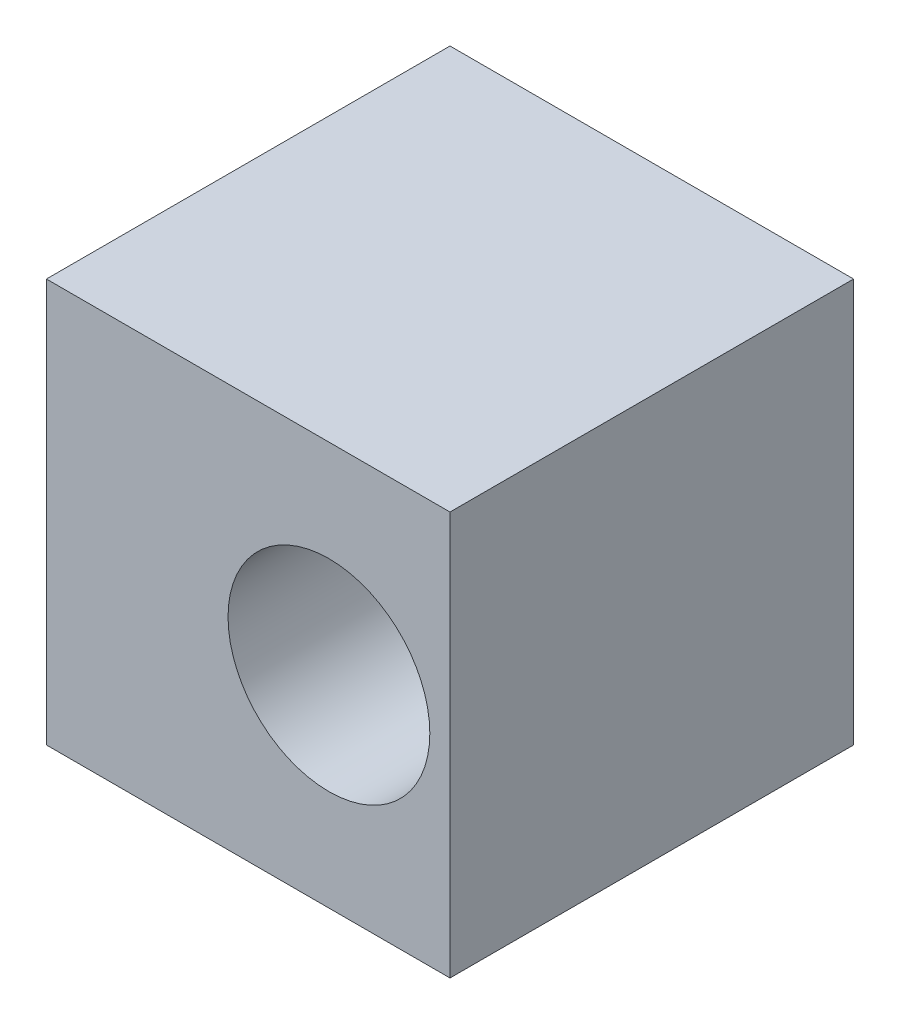
ISO-10303-21;
HEADER;
FILE_DESCRIPTION(('STEP AP214'),'2;1');
FILE_NAME('part.step','',(''),(''),'','','');
FILE_SCHEMA(('AUTOMOTIVE_DESIGN { 1 0 10303 214 1 1 1 1 }'));
ENDSEC;
DATA;
#1=APPLICATION_CONTEXT('core data for automotive mechanical design processes');
#2=APPLICATION_PROTOCOL_DEFINITION('international standard','automotive_design',2000,#1);
#3=PRODUCT_CONTEXT('',#1,'mechanical');
#4=PRODUCT('Part','Part','',(#3));
#5=PRODUCT_RELATED_PRODUCT_CATEGORY('part','',(#4));
#6=PRODUCT_DEFINITION_FORMATION('','',#4);
#7=PRODUCT_DEFINITION_CONTEXT('part definition',#1,'design');
#8=PRODUCT_DEFINITION('design','',#6,#7);
#9=PRODUCT_DEFINITION_SHAPE('','',#8);
#10=(LENGTH_UNIT() NAMED_UNIT(*) SI_UNIT(.MILLI.,.METRE.));
#11=(NAMED_UNIT(*) PLANE_ANGLE_UNIT() SI_UNIT($,.RADIAN.));
#12=(NAMED_UNIT(*) SI_UNIT($,.STERADIAN.) SOLID_ANGLE_UNIT());
#13=UNCERTAINTY_MEASURE_WITH_UNIT(LENGTH_MEASURE(1.E-05),#10,'distance_accuracy_value','');
#14=(GEOMETRIC_REPRESENTATION_CONTEXT(3) GLOBAL_UNCERTAINTY_ASSIGNED_CONTEXT((#13)) GLOBAL_UNIT_ASSIGNED_CONTEXT((#10,
#11,#12)) REPRESENTATION_CONTEXT('',''));
#15=CARTESIAN_POINT('',(0.,0.,0.));
#16=DIRECTION('',(0.,0.,1.));
#17=DIRECTION('',(1.,0.,0.));
#18=AXIS2_PLACEMENT_3D('',#15,#16,#17);
#19=CARTESIAN_POINT('',(0.,0.,10.));
#20=DIRECTION('',(1.,0.,0.));
#21=DIRECTION('',(0.,0.,-1.));
#22=AXIS2_PLACEMENT_3D('',#19,#20,#21);
#23=PLANE('',#22);
#24=DIRECTION('',(0.,-1.,0.));
#25=VECTOR('',#24,1.);
#26=CARTESIAN_POINT('',(0.,0.,0.));
#27=LINE('',#26,#25);
#28=CARTESIAN_POINT('',(0.,10.,0.));
#29=VERTEX_POINT('',#28);
#30=CARTESIAN_POINT('',(0.,0.,0.));
#31=VERTEX_POINT('',#30);
#32=EDGE_CURVE('E98',#29,#31,#27,.T.);
#33=ORIENTED_EDGE('',*,*,#32,.T.);
#34=DIRECTION('',(0.,0.,-1.));
#35=VECTOR('',#34,1.);
#36=CARTESIAN_POINT('',(0.,0.,10.));
#37=LINE('',#36,#35);
#38=CARTESIAN_POINT('',(0.,0.,10.));
#39=VERTEX_POINT('',#38);
#40=EDGE_CURVE('E11',#39,#31,#37,.T.);
#41=ORIENTED_EDGE('',*,*,#40,.F.);
#42=DIRECTION('',(0.,-1.,0.));
#43=VECTOR('',#42,1.);
#44=CARTESIAN_POINT('',(0.,0.,10.));
#45=LINE('',#44,#43);
#46=CARTESIAN_POINT('',(0.,10.,10.));
#47=VERTEX_POINT('',#46);
#48=EDGE_CURVE('E86',#47,#39,#45,.T.);
#49=ORIENTED_EDGE('',*,*,#48,.F.);
#50=DIRECTION('',(0.,0.,-1.));
#51=VECTOR('',#50,1.);
#52=CARTESIAN_POINT('',(0.,10.,10.));
#53=LINE('',#52,#51);
#54=EDGE_CURVE('E94',#47,#29,#53,.T.);
#55=ORIENTED_EDGE('',*,*,#54,.T.);
#56=EDGE_LOOP('',(#33,#41,#49,#55));
#57=FACE_BOUND('',#56,.T.);
#58=ADVANCED_FACE('F35',(#57),#23,.F.);
#59=CARTESIAN_POINT('',(0.,0.,10.));
#60=DIRECTION('',(0.,1.,0.));
#61=DIRECTION('',(0.,0.,1.));
#62=AXIS2_PLACEMENT_3D('',#59,#60,#61);
#63=PLANE('',#62);
#64=DIRECTION('',(1.,0.,0.));
#65=VECTOR('',#64,1.);
#66=CARTESIAN_POINT('',(0.,0.,0.));
#67=LINE('',#66,#65);
#68=CARTESIAN_POINT('',(10.,0.,0.));
#69=VERTEX_POINT('',#68);
#70=EDGE_CURVE('E90',#31,#69,#67,.T.);
#71=ORIENTED_EDGE('',*,*,#70,.T.);
#72=DIRECTION('',(0.,0.,-1.));
#73=VECTOR('',#72,1.);
#74=CARTESIAN_POINT('',(10.,0.,10.));
#75=LINE('',#74,#73);
#76=CARTESIAN_POINT('',(10.,0.,10.));
#77=VERTEX_POINT('',#76);
#78=EDGE_CURVE('E43',#77,#69,#75,.T.);
#79=ORIENTED_EDGE('',*,*,#78,.F.);
#80=DIRECTION('',(1.,0.,0.));
#81=VECTOR('',#80,1.);
#82=CARTESIAN_POINT('',(0.,0.,10.));
#83=LINE('',#82,#81);
#84=EDGE_CURVE('E81',#39,#77,#83,.T.);
#85=ORIENTED_EDGE('',*,*,#84,.F.);
#86=ORIENTED_EDGE('',*,*,#40,.T.);
#87=EDGE_LOOP('',(#71,#79,#85,#86));
#88=FACE_BOUND('',#87,.T.);
#89=ADVANCED_FACE('F89',(#88),#63,.F.);
#90=CARTESIAN_POINT('',(10.,0.,10.));
#91=DIRECTION('',(-1.,0.,0.));
#92=DIRECTION('',(0.,0.,1.));
#93=AXIS2_PLACEMENT_3D('',#90,#91,#92);
#94=PLANE('',#93);
#95=DIRECTION('',(0.,1.,0.));
#96=VECTOR('',#95,1.);
#97=CARTESIAN_POINT('',(10.,0.,0.));
#98=LINE('',#97,#96);
#99=CARTESIAN_POINT('',(10.,10.,0.));
#100=VERTEX_POINT('',#99);
#101=EDGE_CURVE('E68',#69,#100,#98,.T.);
#102=ORIENTED_EDGE('',*,*,#101,.T.);
#103=DIRECTION('',(0.,0.,-1.));
#104=VECTOR('',#103,1.);
#105=CARTESIAN_POINT('',(10.,10.,10.));
#106=LINE('',#105,#104);
#107=CARTESIAN_POINT('',(10.,10.,10.));
#108=VERTEX_POINT('',#107);
#109=EDGE_CURVE('E91',#108,#100,#106,.T.);
#110=ORIENTED_EDGE('',*,*,#109,.F.);
#111=DIRECTION('',(0.,1.,0.));
#112=VECTOR('',#111,1.);
#113=CARTESIAN_POINT('',(10.,0.,10.));
#114=LINE('',#113,#112);
#115=EDGE_CURVE('E84',#77,#108,#114,.T.);
#116=ORIENTED_EDGE('',*,*,#115,.F.);
#117=ORIENTED_EDGE('',*,*,#78,.T.);
#118=EDGE_LOOP('',(#102,#110,#116,#117));
#119=FACE_BOUND('',#118,.T.);
#120=ADVANCED_FACE('F92',(#119),#94,.F.);
#121=CARTESIAN_POINT('',(0.,10.,10.));
#122=DIRECTION('',(0.,-1.,0.));
#123=DIRECTION('',(0.,0.,-1.));
#124=AXIS2_PLACEMENT_3D('',#121,#122,#123);
#125=PLANE('',#124);
#126=DIRECTION('',(-1.,0.,0.));
#127=VECTOR('',#126,1.);
#128=CARTESIAN_POINT('',(0.,10.,0.));
#129=LINE('',#128,#127);
#130=EDGE_CURVE('E74',#100,#29,#129,.T.);
#131=ORIENTED_EDGE('',*,*,#130,.T.);
#132=ORIENTED_EDGE('',*,*,#54,.F.);
#133=DIRECTION('',(-1.,0.,0.));
#134=VECTOR('',#133,1.);
#135=CARTESIAN_POINT('',(0.,10.,10.));
#136=LINE('',#135,#134);
#137=EDGE_CURVE('E51',#108,#47,#136,.T.);
#138=ORIENTED_EDGE('',*,*,#137,.F.);
#139=ORIENTED_EDGE('',*,*,#109,.T.);
#140=EDGE_LOOP('',(#131,#132,#138,#139));
#141=FACE_BOUND('',#140,.T.);
#142=ADVANCED_FACE('F106',(#141),#125,.F.);
#143=CARTESIAN_POINT('',(0.,0.,10.));
#144=DIRECTION('',(0.,0.,-1.));
#145=DIRECTION('',(-1.,0.,0.));
#146=AXIS2_PLACEMENT_3D('',#143,#144,#145);
#147=PLANE('',#146);
#148=CARTESIAN_POINT('',(7.,5.,10.));
#149=DIRECTION('',(0.,0.,1.));
#150=DIRECTION('',(1.,0.,0.));
#151=AXIS2_PLACEMENT_3D('',#148,#149,#150);
#152=CIRCLE('',#151,2.5);
#153=CARTESIAN_POINT('',(9.5,5.,10.));
#154=VERTEX_POINT('',#153);
#155=EDGE_CURVE('E112',#154,#154,#152,.T.);
#156=ORIENTED_EDGE('',*,*,#155,.F.);
#157=EDGE_LOOP('',(#156));
#158=FACE_BOUND('',#157,.T.);
#159=ORIENTED_EDGE('',*,*,#48,.T.);
#160=ORIENTED_EDGE('',*,*,#84,.T.);
#161=ORIENTED_EDGE('',*,*,#115,.T.);
#162=ORIENTED_EDGE('',*,*,#137,.T.);
#163=EDGE_LOOP('',(#159,#160,#161,#162));
#164=FACE_BOUND('',#163,.T.);
#165=ADVANCED_FACE('F82',(#158,#164),#147,.F.);
#166=CARTESIAN_POINT('',(0.,0.,0.));
#167=DIRECTION('',(0.,0.,-1.));
#168=DIRECTION('',(-1.,0.,0.));
#169=AXIS2_PLACEMENT_3D('',#166,#167,#168);
#170=PLANE('',#169);
#171=CARTESIAN_POINT('',(7.,5.,0.));
#172=DIRECTION('',(0.,0.,1.));
#173=DIRECTION('',(1.,0.,0.));
#174=AXIS2_PLACEMENT_3D('',#171,#172,#173);
#175=CIRCLE('',#174,2.5);
#176=CARTESIAN_POINT('',(9.5,5.,0.));
#177=VERTEX_POINT('',#176);
#178=EDGE_CURVE('E101',#177,#177,#175,.T.);
#179=ORIENTED_EDGE('',*,*,#178,.T.);
#180=EDGE_LOOP('',(#179));
#181=FACE_BOUND('',#180,.T.);
#182=ORIENTED_EDGE('',*,*,#32,.F.);
#183=ORIENTED_EDGE('',*,*,#130,.F.);
#184=ORIENTED_EDGE('',*,*,#101,.F.);
#185=ORIENTED_EDGE('',*,*,#70,.F.);
#186=EDGE_LOOP('',(#182,#183,#184,#185));
#187=FACE_BOUND('',#186,.T.);
#188=ADVANCED_FACE('F109',(#181,#187),#170,.T.);
#189=CARTESIAN_POINT('',(7.,5.,0.));
#190=DIRECTION('',(0.,0.,1.));
#191=DIRECTION('',(1.,0.,0.));
#192=AXIS2_PLACEMENT_3D('',#189,#190,#191);
#193=CYLINDRICAL_SURFACE('',#192,2.5);
#194=ORIENTED_EDGE('',*,*,#178,.F.);
#195=EDGE_LOOP('',(#194));
#196=FACE_BOUND('',#195,.T.);
#197=ORIENTED_EDGE('',*,*,#155,.T.);
#198=EDGE_LOOP('',(#197));
#199=FACE_BOUND('',#198,.T.);
#200=ADVANCED_FACE('F119',(#196,#199),#193,.F.);
#201=CLOSED_SHELL('',(#58,#89,#120,#142,#165,#188,#200));
#202=MANIFOLD_SOLID_BREP('B2',#201);
#203=ADVANCED_BREP_SHAPE_REPRESENTATION('',(#18,#202),#14);
#204=SHAPE_DEFINITION_REPRESENTATION(#9,#203);
ENDSEC;
END-ISO-10303-21;
